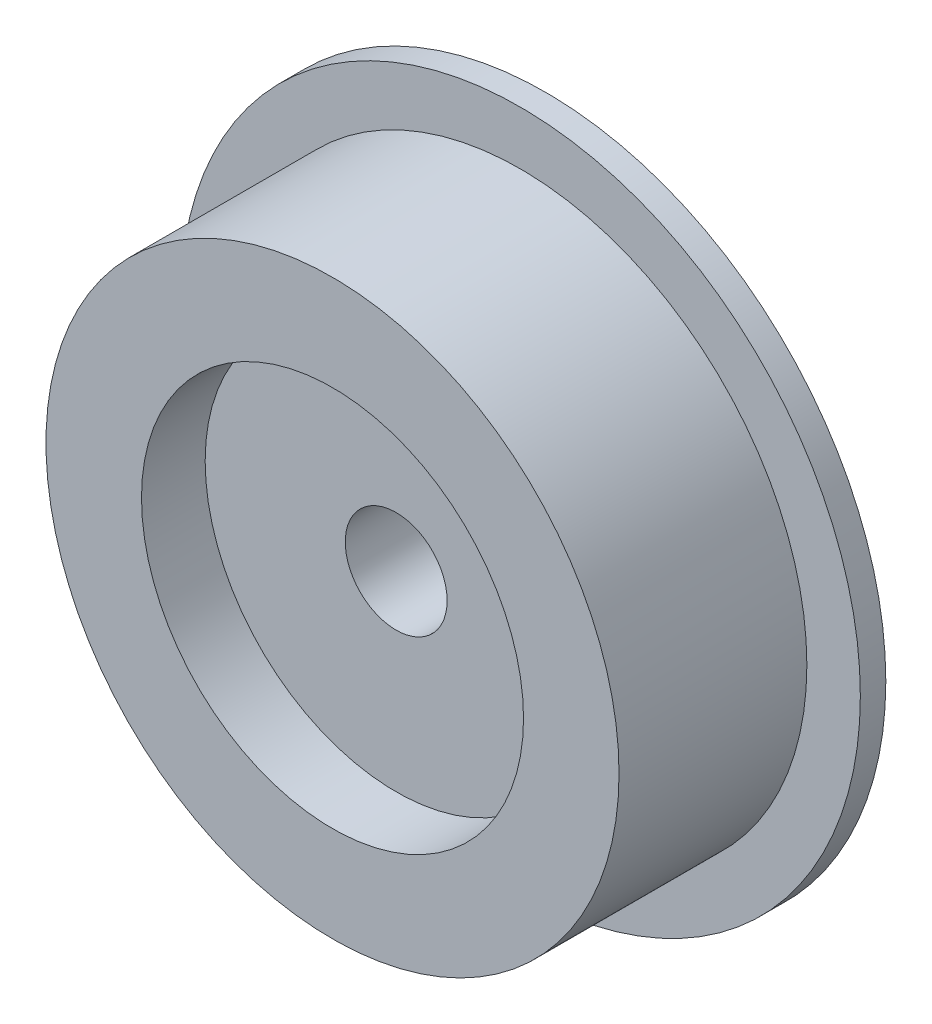
ISO-10303-21;
HEADER;
FILE_DESCRIPTION(('STEP AP214'),'2;1');
FILE_NAME('part.step','',(''),(''),'','','');
FILE_SCHEMA(('AUTOMOTIVE_DESIGN { 1 0 10303 214 1 1 1 1 }'));
ENDSEC;
DATA;
#1=APPLICATION_CONTEXT('core data for automotive mechanical design processes');
#2=APPLICATION_PROTOCOL_DEFINITION('international standard','automotive_design',2000,#1);
#3=PRODUCT_CONTEXT('',#1,'mechanical');
#4=PRODUCT('Part','Part','',(#3));
#5=PRODUCT_RELATED_PRODUCT_CATEGORY('part','',(#4));
#6=PRODUCT_DEFINITION_FORMATION('','',#4);
#7=PRODUCT_DEFINITION_CONTEXT('part definition',#1,'design');
#8=PRODUCT_DEFINITION('design','',#6,#7);
#9=PRODUCT_DEFINITION_SHAPE('','',#8);
#10=(LENGTH_UNIT() NAMED_UNIT(*) SI_UNIT(.MILLI.,.METRE.));
#11=(NAMED_UNIT(*) PLANE_ANGLE_UNIT() SI_UNIT($,.RADIAN.));
#12=(NAMED_UNIT(*) SI_UNIT($,.STERADIAN.) SOLID_ANGLE_UNIT());
#13=UNCERTAINTY_MEASURE_WITH_UNIT(LENGTH_MEASURE(1.E-05),#10,'distance_accuracy_value','');
#14=(GEOMETRIC_REPRESENTATION_CONTEXT(3) GLOBAL_UNCERTAINTY_ASSIGNED_CONTEXT((#13)) GLOBAL_UNIT_ASSIGNED_CONTEXT((#10,
#11,#12)) REPRESENTATION_CONTEXT('',''));
#15=CARTESIAN_POINT('',(0.,0.,0.));
#16=DIRECTION('',(0.,0.,1.));
#17=DIRECTION('',(1.,0.,0.));
#18=AXIS2_PLACEMENT_3D('',#15,#16,#17);
#19=CARTESIAN_POINT('',(0.,0.,-38.5));
#20=DIRECTION('',(0.,0.,1.));
#21=DIRECTION('',(1.,0.,0.));
#22=AXIS2_PLACEMENT_3D('',#19,#20,#21);
#23=CYLINDRICAL_SURFACE('',#22,8.);
#24=CARTESIAN_POINT('',(0.,0.,-38.5));
#25=DIRECTION('',(0.,0.,1.));
#26=DIRECTION('',(1.,0.,0.));
#27=AXIS2_PLACEMENT_3D('',#24,#25,#26);
#28=CIRCLE('',#27,8.);
#29=CARTESIAN_POINT('',(8.,0.,-38.5));
#30=VERTEX_POINT('',#29);
#31=EDGE_CURVE('E52',#30,#30,#28,.T.);
#32=ORIENTED_EDGE('',*,*,#31,.F.);
#33=EDGE_LOOP('',(#32));
#34=FACE_BOUND('',#33,.T.);
#35=CARTESIAN_POINT('',(0.,0.,-15.));
#36=DIRECTION('',(0.,0.,1.));
#37=DIRECTION('',(1.,0.,0.));
#38=AXIS2_PLACEMENT_3D('',#35,#36,#37);
#39=CIRCLE('',#38,8.);
#40=CARTESIAN_POINT('',(8.,0.,-15.));
#41=VERTEX_POINT('',#40);
#42=EDGE_CURVE('E47',#41,#41,#39,.F.);
#43=ORIENTED_EDGE('',*,*,#42,.F.);
#44=EDGE_LOOP('',(#43));
#45=FACE_BOUND('',#44,.T.);
#46=ADVANCED_FACE('F43',(#34,#45),#23,.F.);
#47=CARTESIAN_POINT('',(0.,0.,-34.5));
#48=DIRECTION('',(0.,0.,1.));
#49=DIRECTION('',(1.,0.,0.));
#50=AXIS2_PLACEMENT_3D('',#47,#48,#49);
#51=CYLINDRICAL_SURFACE('',#50,45.);
#52=CARTESIAN_POINT('',(0.,0.,-34.5));
#53=DIRECTION('',(0.,0.,1.));
#54=DIRECTION('',(1.,0.,0.));
#55=AXIS2_PLACEMENT_3D('',#52,#53,#54);
#56=CIRCLE('',#55,45.);
#57=CARTESIAN_POINT('',(45.,0.,-34.5));
#58=VERTEX_POINT('',#57);
#59=EDGE_CURVE('E64',#58,#58,#56,.T.);
#60=ORIENTED_EDGE('',*,*,#59,.T.);
#61=EDGE_LOOP('',(#60));
#62=FACE_BOUND('',#61,.T.);
#63=CARTESIAN_POINT('',(0.,0.,-5.));
#64=DIRECTION('',(0.,0.,1.));
#65=DIRECTION('',(1.,0.,0.));
#66=AXIS2_PLACEMENT_3D('',#63,#64,#65);
#67=CIRCLE('',#66,45.);
#68=CARTESIAN_POINT('',(45.,0.,-5.));
#69=VERTEX_POINT('',#68);
#70=EDGE_CURVE('E61',#69,#69,#67,.F.);
#71=ORIENTED_EDGE('',*,*,#70,.T.);
#72=EDGE_LOOP('',(#71));
#73=FACE_BOUND('',#72,.T.);
#74=ADVANCED_FACE('F137',(#62,#73),#51,.T.);
#75=CARTESIAN_POINT('',(0.,0.,-38.5));
#76=DIRECTION('',(0.,0.,1.));
#77=DIRECTION('',(1.,0.,0.));
#78=AXIS2_PLACEMENT_3D('',#75,#76,#77);
#79=CYLINDRICAL_SURFACE('',#78,53.4);
#80=CARTESIAN_POINT('',(0.,0.,-38.5));
#81=DIRECTION('',(0.,0.,1.));
#82=DIRECTION('',(1.,0.,0.));
#83=AXIS2_PLACEMENT_3D('',#80,#81,#82);
#84=CIRCLE('',#83,53.4);
#85=CARTESIAN_POINT('',(53.4,0.,-38.5));
#86=VERTEX_POINT('',#85);
#87=EDGE_CURVE('E11',#86,#86,#84,.T.);
#88=ORIENTED_EDGE('',*,*,#87,.T.);
#89=EDGE_LOOP('',(#88));
#90=FACE_BOUND('',#89,.T.);
#91=CARTESIAN_POINT('',(0.,0.,-34.5));
#92=DIRECTION('',(0.,0.,1.));
#93=DIRECTION('',(1.,0.,0.));
#94=AXIS2_PLACEMENT_3D('',#91,#92,#93);
#95=CIRCLE('',#94,53.4);
#96=CARTESIAN_POINT('',(53.4,0.,-34.5));
#97=VERTEX_POINT('',#96);
#98=EDGE_CURVE('E70',#97,#97,#95,.T.);
#99=ORIENTED_EDGE('',*,*,#98,.F.);
#100=EDGE_LOOP('',(#99));
#101=FACE_BOUND('',#100,.T.);
#102=ADVANCED_FACE('F45',(#90,#101),#79,.T.);
#103=CARTESIAN_POINT('',(0.,0.,-38.5));
#104=DIRECTION('',(0.,0.,1.));
#105=DIRECTION('',(1.,0.,0.));
#106=AXIS2_PLACEMENT_3D('',#103,#104,#105);
#107=PLANE('',#106);
#108=CARTESIAN_POINT('',(30.,0.,-38.5));
#109=DIRECTION('',(0.,0.,-1.));
#110=DIRECTION('',(-1.,0.,0.));
#111=AXIS2_PLACEMENT_3D('',#108,#109,#110);
#112=CIRCLE('',#111,2.5);
#113=CARTESIAN_POINT('',(27.5,0.,-38.5));
#114=VERTEX_POINT('',#113);
#115=EDGE_CURVE('E93',#114,#114,#112,.T.);
#116=ORIENTED_EDGE('',*,*,#115,.F.);
#117=EDGE_LOOP('',(#116));
#118=FACE_BOUND('',#117,.T.);
#119=CARTESIAN_POINT('',(0.,30.,-38.5));
#120=DIRECTION('',(0.,0.,-1.));
#121=DIRECTION('',(-1.,0.,0.));
#122=AXIS2_PLACEMENT_3D('',#119,#120,#121);
#123=CIRCLE('',#122,2.5);
#124=CARTESIAN_POINT('',(-2.5,30.,-38.5));
#125=VERTEX_POINT('',#124);
#126=EDGE_CURVE('E97',#125,#125,#123,.T.);
#127=ORIENTED_EDGE('',*,*,#126,.F.);
#128=EDGE_LOOP('',(#127));
#129=FACE_BOUND('',#128,.T.);
#130=CARTESIAN_POINT('',(-30.,0.,-38.5));
#131=DIRECTION('',(0.,0.,-1.));
#132=DIRECTION('',(-1.,0.,0.));
#133=AXIS2_PLACEMENT_3D('',#130,#131,#132);
#134=CIRCLE('',#133,2.5);
#135=CARTESIAN_POINT('',(-32.5,0.,-38.5));
#136=VERTEX_POINT('',#135);
#137=EDGE_CURVE('E105',#136,#136,#134,.T.);
#138=ORIENTED_EDGE('',*,*,#137,.F.);
#139=EDGE_LOOP('',(#138));
#140=FACE_BOUND('',#139,.T.);
#141=CARTESIAN_POINT('',(0.,-30.,-38.5));
#142=DIRECTION('',(0.,0.,-1.));
#143=DIRECTION('',(-1.,0.,0.));
#144=AXIS2_PLACEMENT_3D('',#141,#142,#143);
#145=CIRCLE('',#144,2.5);
#146=CARTESIAN_POINT('',(-2.5,-30.,-38.5));
#147=VERTEX_POINT('',#146);
#148=EDGE_CURVE('E113',#147,#147,#145,.T.);
#149=ORIENTED_EDGE('',*,*,#148,.F.);
#150=EDGE_LOOP('',(#149));
#151=FACE_BOUND('',#150,.T.);
#152=ORIENTED_EDGE('',*,*,#31,.T.);
#153=EDGE_LOOP('',(#152));
#154=FACE_BOUND('',#153,.T.);
#155=ORIENTED_EDGE('',*,*,#87,.F.);
#156=EDGE_LOOP('',(#155));
#157=FACE_BOUND('',#156,.T.);
#158=ADVANCED_FACE('F125',(#118,#129,#140,#151,#154,#157),#107,.F.);
#159=CARTESIAN_POINT('',(0.,-30.,-18.5));
#160=DIRECTION('',(0.,0.,-1.));
#161=DIRECTION('',(-1.,0.,0.));
#162=AXIS2_PLACEMENT_3D('',#159,#160,#161);
#163=CYLINDRICAL_SURFACE('',#162,2.5);
#164=CARTESIAN_POINT('',(0.,-30.,-18.5));
#165=DIRECTION('',(0.,0.,-1.));
#166=DIRECTION('',(-1.,0.,0.));
#167=AXIS2_PLACEMENT_3D('',#164,#165,#166);
#168=CIRCLE('',#167,2.5);
#169=CARTESIAN_POINT('',(-2.5,-30.,-18.5));
#170=VERTEX_POINT('',#169);
#171=EDGE_CURVE('E89',#170,#170,#168,.T.);
#172=ORIENTED_EDGE('',*,*,#171,.F.);
#173=EDGE_LOOP('',(#172));
#174=FACE_BOUND('',#173,.T.);
#175=ORIENTED_EDGE('',*,*,#148,.T.);
#176=EDGE_LOOP('',(#175));
#177=FACE_BOUND('',#176,.T.);
#178=ADVANCED_FACE('F122',(#174,#177),#163,.F.);
#179=CARTESIAN_POINT('',(0.,-30.,-18.5));
#180=DIRECTION('',(0.,0.,-1.));
#181=DIRECTION('',(-1.,0.,0.));
#182=AXIS2_PLACEMENT_3D('',#179,#180,#181);
#183=PLANE('',#182);
#184=ORIENTED_EDGE('',*,*,#171,.T.);
#185=EDGE_LOOP('',(#184));
#186=FACE_BOUND('',#185,.T.);
#187=ADVANCED_FACE('F120',(#186),#183,.T.);
#188=CARTESIAN_POINT('',(-30.,0.,-18.5));
#189=DIRECTION('',(0.,0.,-1.));
#190=DIRECTION('',(-1.,0.,0.));
#191=AXIS2_PLACEMENT_3D('',#188,#189,#190);
#192=CYLINDRICAL_SURFACE('',#191,2.5);
#193=CARTESIAN_POINT('',(-30.,0.,-18.5));
#194=DIRECTION('',(0.,0.,-1.));
#195=DIRECTION('',(-1.,0.,0.));
#196=AXIS2_PLACEMENT_3D('',#193,#194,#195);
#197=CIRCLE('',#196,2.5);
#198=CARTESIAN_POINT('',(-32.5,0.,-18.5));
#199=VERTEX_POINT('',#198);
#200=EDGE_CURVE('E109',#199,#199,#197,.T.);
#201=ORIENTED_EDGE('',*,*,#200,.F.);
#202=EDGE_LOOP('',(#201));
#203=FACE_BOUND('',#202,.T.);
#204=ORIENTED_EDGE('',*,*,#137,.T.);
#205=EDGE_LOOP('',(#204));
#206=FACE_BOUND('',#205,.T.);
#207=ADVANCED_FACE('F146',(#203,#206),#192,.F.);
#208=CARTESIAN_POINT('',(-30.,0.,-18.5));
#209=DIRECTION('',(0.,0.,-1.));
#210=DIRECTION('',(-1.,0.,0.));
#211=AXIS2_PLACEMENT_3D('',#208,#209,#210);
#212=PLANE('',#211);
#213=ORIENTED_EDGE('',*,*,#200,.T.);
#214=EDGE_LOOP('',(#213));
#215=FACE_BOUND('',#214,.T.);
#216=ADVANCED_FACE('F148',(#215),#212,.T.);
#217=CARTESIAN_POINT('',(0.,30.,-18.5));
#218=DIRECTION('',(0.,0.,-1.));
#219=DIRECTION('',(-1.,0.,0.));
#220=AXIS2_PLACEMENT_3D('',#217,#218,#219);
#221=CYLINDRICAL_SURFACE('',#220,2.5);
#222=CARTESIAN_POINT('',(0.,30.,-18.5));
#223=DIRECTION('',(0.,0.,-1.));
#224=DIRECTION('',(-1.,0.,0.));
#225=AXIS2_PLACEMENT_3D('',#222,#223,#224);
#226=CIRCLE('',#225,2.5);
#227=CARTESIAN_POINT('',(-2.5,30.,-18.5));
#228=VERTEX_POINT('',#227);
#229=EDGE_CURVE('E101',#228,#228,#226,.T.);
#230=ORIENTED_EDGE('',*,*,#229,.F.);
#231=EDGE_LOOP('',(#230));
#232=FACE_BOUND('',#231,.T.);
#233=ORIENTED_EDGE('',*,*,#126,.T.);
#234=EDGE_LOOP('',(#233));
#235=FACE_BOUND('',#234,.T.);
#236=ADVANCED_FACE('F151',(#232,#235),#221,.F.);
#237=CARTESIAN_POINT('',(0.,30.,-18.5));
#238=DIRECTION('',(0.,0.,-1.));
#239=DIRECTION('',(-1.,0.,0.));
#240=AXIS2_PLACEMENT_3D('',#237,#238,#239);
#241=PLANE('',#240);
#242=ORIENTED_EDGE('',*,*,#229,.T.);
#243=EDGE_LOOP('',(#242));
#244=FACE_BOUND('',#243,.T.);
#245=ADVANCED_FACE('F156',(#244),#241,.T.);
#246=CARTESIAN_POINT('',(30.,0.,-18.5));
#247=DIRECTION('',(0.,0.,-1.));
#248=DIRECTION('',(-1.,0.,0.));
#249=AXIS2_PLACEMENT_3D('',#246,#247,#248);
#250=CYLINDRICAL_SURFACE('',#249,2.5);
#251=CARTESIAN_POINT('',(30.,0.,-18.5));
#252=DIRECTION('',(0.,0.,-1.));
#253=DIRECTION('',(-1.,0.,0.));
#254=AXIS2_PLACEMENT_3D('',#251,#252,#253);
#255=CIRCLE('',#254,2.5);
#256=CARTESIAN_POINT('',(27.5,0.,-18.5));
#257=VERTEX_POINT('',#256);
#258=EDGE_CURVE('E58',#257,#257,#255,.T.);
#259=ORIENTED_EDGE('',*,*,#258,.F.);
#260=EDGE_LOOP('',(#259));
#261=FACE_BOUND('',#260,.T.);
#262=ORIENTED_EDGE('',*,*,#115,.T.);
#263=EDGE_LOOP('',(#262));
#264=FACE_BOUND('',#263,.T.);
#265=ADVANCED_FACE('F159',(#261,#264),#250,.F.);
#266=CARTESIAN_POINT('',(30.,0.,-18.5));
#267=DIRECTION('',(0.,0.,-1.));
#268=DIRECTION('',(-1.,0.,0.));
#269=AXIS2_PLACEMENT_3D('',#266,#267,#268);
#270=PLANE('',#269);
#271=ORIENTED_EDGE('',*,*,#258,.T.);
#272=EDGE_LOOP('',(#271));
#273=FACE_BOUND('',#272,.T.);
#274=ADVANCED_FACE('F166',(#273),#270,.T.);
#275=CARTESIAN_POINT('',(0.,0.,-34.5));
#276=DIRECTION('',(0.,0.,1.));
#277=DIRECTION('',(1.,0.,0.));
#278=AXIS2_PLACEMENT_3D('',#275,#276,#277);
#279=PLANE('',#278);
#280=ORIENTED_EDGE('',*,*,#59,.F.);
#281=EDGE_LOOP('',(#280));
#282=FACE_BOUND('',#281,.T.);
#283=ORIENTED_EDGE('',*,*,#98,.T.);
#284=EDGE_LOOP('',(#283));
#285=FACE_BOUND('',#284,.T.);
#286=ADVANCED_FACE('F170',(#282,#285),#279,.T.);
#287=CARTESIAN_POINT('',(0.,0.,-5.));
#288=DIRECTION('',(0.,0.,1.));
#289=DIRECTION('',(1.,0.,0.));
#290=AXIS2_PLACEMENT_3D('',#287,#288,#289);
#291=PLANE('',#290);
#292=CARTESIAN_POINT('',(0.,0.,-5.));
#293=DIRECTION('',(0.,0.,1.));
#294=DIRECTION('',(1.,0.,0.));
#295=AXIS2_PLACEMENT_3D('',#292,#293,#294);
#296=CIRCLE('',#295,30.);
#297=CARTESIAN_POINT('',(30.,0.,-5.));
#298=VERTEX_POINT('',#297);
#299=EDGE_CURVE('E78',#298,#298,#296,.T.);
#300=ORIENTED_EDGE('',*,*,#299,.F.);
#301=EDGE_LOOP('',(#300));
#302=FACE_BOUND('',#301,.T.);
#303=ORIENTED_EDGE('',*,*,#70,.F.);
#304=EDGE_LOOP('',(#303));
#305=FACE_BOUND('',#304,.T.);
#306=ADVANCED_FACE('F173',(#302,#305),#291,.T.);
#307=CARTESIAN_POINT('',(0.,0.,-15.));
#308=DIRECTION('',(0.,0.,1.));
#309=DIRECTION('',(1.,0.,0.));
#310=AXIS2_PLACEMENT_3D('',#307,#308,#309);
#311=PLANE('',#310);
#312=CARTESIAN_POINT('',(0.,0.,-15.));
#313=DIRECTION('',(0.,0.,1.));
#314=DIRECTION('',(1.,0.,0.));
#315=AXIS2_PLACEMENT_3D('',#312,#313,#314);
#316=CIRCLE('',#315,30.);
#317=CARTESIAN_POINT('',(30.,0.,-15.));
#318=VERTEX_POINT('',#317);
#319=EDGE_CURVE('E73',#318,#318,#316,.T.);
#320=ORIENTED_EDGE('',*,*,#319,.T.);
#321=EDGE_LOOP('',(#320));
#322=FACE_BOUND('',#321,.T.);
#323=ORIENTED_EDGE('',*,*,#42,.T.);
#324=EDGE_LOOP('',(#323));
#325=FACE_BOUND('',#324,.T.);
#326=ADVANCED_FACE('F178',(#322,#325),#311,.T.);
#327=CARTESIAN_POINT('',(0.,0.,-15.));
#328=DIRECTION('',(0.,0.,1.));
#329=DIRECTION('',(1.,0.,0.));
#330=AXIS2_PLACEMENT_3D('',#327,#328,#329);
#331=CYLINDRICAL_SURFACE('',#330,30.);
#332=ORIENTED_EDGE('',*,*,#319,.F.);
#333=EDGE_LOOP('',(#332));
#334=FACE_BOUND('',#333,.T.);
#335=ORIENTED_EDGE('',*,*,#299,.T.);
#336=EDGE_LOOP('',(#335));
#337=FACE_BOUND('',#336,.T.);
#338=ADVANCED_FACE('F180',(#334,#337),#331,.F.);
#339=CLOSED_SHELL('',(#46,#74,#102,#158,#178,#187,#207,#216,#236,#245,#265,#274,#286,#306,#326,#338));
#340=MANIFOLD_SOLID_BREP('B2',#339);
#341=ADVANCED_BREP_SHAPE_REPRESENTATION('',(#18,#340),#14);
#342=SHAPE_DEFINITION_REPRESENTATION(#9,#341);
ENDSEC;
END-ISO-10303-21;
